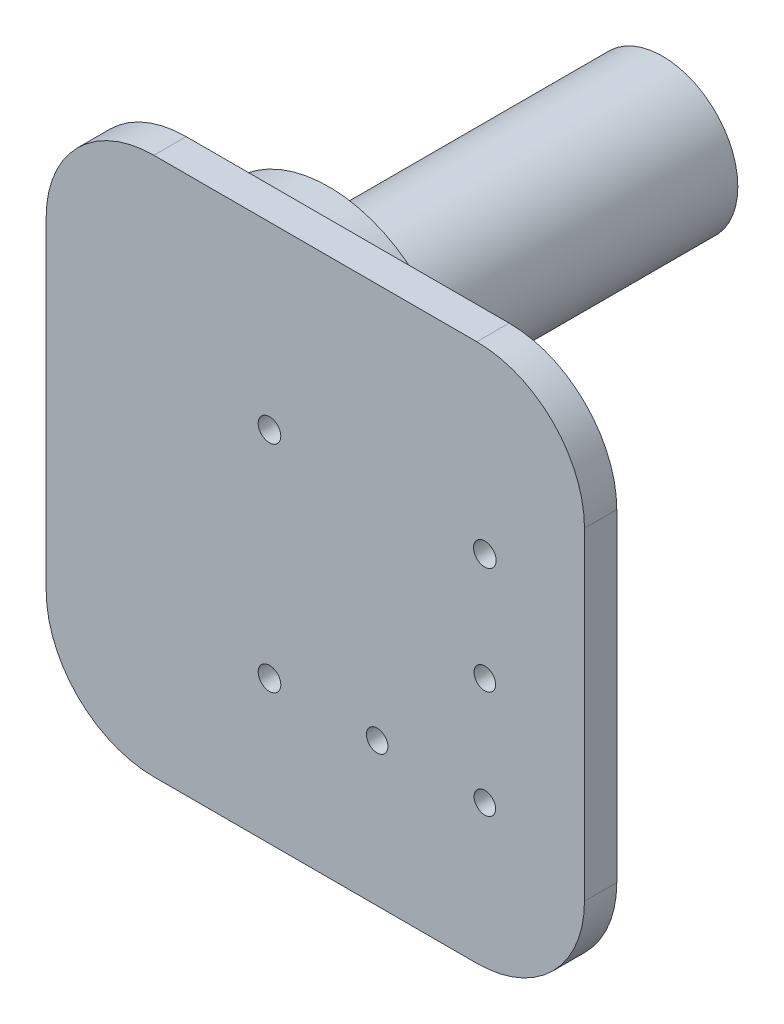
ISO-10303-21;
HEADER;
FILE_DESCRIPTION(('STEP AP214'),'2;1');
FILE_NAME('part.step','',(''),(''),'','','');
FILE_SCHEMA(('AUTOMOTIVE_DESIGN { 1 0 10303 214 1 1 1 1 }'));
ENDSEC;
DATA;
#1=APPLICATION_CONTEXT('core data for automotive mechanical design processes');
#2=APPLICATION_PROTOCOL_DEFINITION('international standard','automotive_design',2000,#1);
#3=PRODUCT_CONTEXT('',#1,'mechanical');
#4=PRODUCT('Part','Part','',(#3));
#5=PRODUCT_RELATED_PRODUCT_CATEGORY('part','',(#4));
#6=PRODUCT_DEFINITION_FORMATION('','',#4);
#7=PRODUCT_DEFINITION_CONTEXT('part definition',#1,'design');
#8=PRODUCT_DEFINITION('design','',#6,#7);
#9=PRODUCT_DEFINITION_SHAPE('','',#8);
#10=(LENGTH_UNIT() NAMED_UNIT(*) SI_UNIT(.MILLI.,.METRE.));
#11=(NAMED_UNIT(*) PLANE_ANGLE_UNIT() SI_UNIT($,.RADIAN.));
#12=(NAMED_UNIT(*) SI_UNIT($,.STERADIAN.) SOLID_ANGLE_UNIT());
#13=UNCERTAINTY_MEASURE_WITH_UNIT(LENGTH_MEASURE(1.E-05),#10,'distance_accuracy_value','');
#14=(GEOMETRIC_REPRESENTATION_CONTEXT(3) GLOBAL_UNCERTAINTY_ASSIGNED_CONTEXT((#13)) GLOBAL_UNIT_ASSIGNED_CONTEXT((#10,
#11,#12)) REPRESENTATION_CONTEXT('',''));
#15=CARTESIAN_POINT('',(0.,0.,0.));
#16=DIRECTION('',(0.,0.,1.));
#17=DIRECTION('',(1.,0.,0.));
#18=AXIS2_PLACEMENT_3D('',#15,#16,#17);
#19=CARTESIAN_POINT('',(-86.6066497970745,-63.7835303855215,34.));
#20=DIRECTION('',(0.,0.,-1.));
#21=DIRECTION('',(-1.,0.,0.));
#22=AXIS2_PLACEMENT_3D('',#19,#20,#21);
#23=CYLINDRICAL_SURFACE('',#22,7.00000000000002);
#24=CARTESIAN_POINT('',(-86.6066497970745,-63.7835303855215,0.));
#25=DIRECTION('',(0.,0.,1.));
#26=DIRECTION('',(1.,0.,0.));
#27=AXIS2_PLACEMENT_3D('',#24,#25,#26);
#28=CIRCLE('',#27,7.00000000000002);
#29=CARTESIAN_POINT('',(-79.6066497970745,-63.7835303855215,0.));
#30=VERTEX_POINT('',#29);
#31=EDGE_CURVE('E154',#30,#30,#28,.T.);
#32=ORIENTED_EDGE('',*,*,#31,.T.);
#33=EDGE_LOOP('',(#32));
#34=FACE_BOUND('',#33,.T.);
#35=CARTESIAN_POINT('',(-86.6066497970745,-63.7835303855215,31.));
#36=DIRECTION('',(0.,0.,1.));
#37=DIRECTION('',(1.,0.,0.));
#38=AXIS2_PLACEMENT_3D('',#35,#36,#37);
#39=CIRCLE('',#38,7.00000000000002);
#40=CARTESIAN_POINT('',(-79.6066497970745,-63.7835303855215,31.));
#41=VERTEX_POINT('',#40);
#42=EDGE_CURVE('E157',#41,#41,#39,.T.);
#43=ORIENTED_EDGE('',*,*,#42,.F.);
#44=EDGE_LOOP('',(#43));
#45=FACE_BOUND('',#44,.T.);
#46=ADVANCED_FACE('F43',(#34,#45),#23,.T.);
#47=CARTESIAN_POINT('',(-86.6066497970745,-63.7835303855215,0.));
#48=DIRECTION('',(0.,0.,1.));
#49=DIRECTION('',(1.,0.,0.));
#50=AXIS2_PLACEMENT_3D('',#47,#48,#49);
#51=PLANE('',#50);
#52=ORIENTED_EDGE('',*,*,#31,.F.);
#53=EDGE_LOOP('',(#52));
#54=FACE_BOUND('',#53,.T.);
#55=ADVANCED_FACE('F254',(#54),#51,.F.);
#56=CARTESIAN_POINT('',(-86.6066497970745,-63.7835303855215,36.));
#57=DIRECTION('',(0.,0.,-1.));
#58=DIRECTION('',(-1.,0.,0.));
#59=AXIS2_PLACEMENT_3D('',#56,#57,#58);
#60=CYLINDRICAL_SURFACE('',#59,12.);
#61=CARTESIAN_POINT('',(-86.6066497970745,-63.7835303855215,36.));
#62=DIRECTION('',(0.,0.,1.));
#63=DIRECTION('',(1.,0.,0.));
#64=AXIS2_PLACEMENT_3D('',#61,#62,#63);
#65=CIRCLE('',#64,12.);
#66=CARTESIAN_POINT('',(-74.6066497970745,-63.7835303855215,36.));
#67=VERTEX_POINT('',#66);
#68=EDGE_CURVE('E150',#67,#67,#65,.T.);
#69=ORIENTED_EDGE('',*,*,#68,.F.);
#70=EDGE_LOOP('',(#69));
#71=FACE_BOUND('',#70,.T.);
#72=CARTESIAN_POINT('',(-86.6066497970745,-63.7835303855215,31.));
#73=DIRECTION('',(0.,0.,1.));
#74=DIRECTION('',(1.,0.,0.));
#75=AXIS2_PLACEMENT_3D('',#72,#73,#74);
#76=CIRCLE('',#75,12.);
#77=CARTESIAN_POINT('',(-74.6066497970745,-63.7835303855215,31.));
#78=VERTEX_POINT('',#77);
#79=EDGE_CURVE('E147',#78,#78,#76,.T.);
#80=ORIENTED_EDGE('',*,*,#79,.T.);
#81=EDGE_LOOP('',(#80));
#82=FACE_BOUND('',#81,.T.);
#83=ADVANCED_FACE('F261',(#71,#82),#60,.T.);
#84=CARTESIAN_POINT('',(-86.6066497970745,-63.7835303855215,31.));
#85=DIRECTION('',(0.,0.,1.));
#86=DIRECTION('',(1.,0.,0.));
#87=AXIS2_PLACEMENT_3D('',#84,#85,#86);
#88=PLANE('',#87);
#89=ORIENTED_EDGE('',*,*,#42,.T.);
#90=EDGE_LOOP('',(#89));
#91=FACE_BOUND('',#90,.T.);
#92=ORIENTED_EDGE('',*,*,#79,.F.);
#93=EDGE_LOOP('',(#92));
#94=FACE_BOUND('',#93,.T.);
#95=ADVANCED_FACE('F392',(#91,#94),#88,.F.);
#96=CARTESIAN_POINT('',(-104.849508922741,-49.3812563089697,39.));
#97=DIRECTION('',(1.,0.,0.));
#98=DIRECTION('',(0.,0.,-1.));
#99=AXIS2_PLACEMENT_3D('',#96,#97,#98);
#100=PLANE('',#99);
#101=DIRECTION('',(0.,-1.,0.));
#102=VECTOR('',#101,1.);
#103=CARTESIAN_POINT('',(-104.849508922741,-49.3812563089697,36.));
#104=LINE('',#103,#102);
#105=CARTESIAN_POINT('',(-104.849508922741,-59.3812563089697,36.));
#106=VERTEX_POINT('',#105);
#107=CARTESIAN_POINT('',(-104.849508922741,-89.3812563089697,36.));
#108=VERTEX_POINT('',#107);
#109=EDGE_CURVE('E136',#106,#108,#104,.T.);
#110=ORIENTED_EDGE('',*,*,#109,.T.);
#111=DIRECTION('',(0.,0.,-1.));
#112=VECTOR('',#111,1.);
#113=CARTESIAN_POINT('',(-104.849508922741,-89.3812563089697,39.));
#114=LINE('',#113,#112);
#115=CARTESIAN_POINT('',(-104.849508922741,-89.3812563089697,39.));
#116=VERTEX_POINT('',#115);
#117=EDGE_CURVE('E114',#108,#116,#114,.F.);
#118=ORIENTED_EDGE('',*,*,#117,.T.);
#119=DIRECTION('',(0.,-1.,0.));
#120=VECTOR('',#119,1.);
#121=CARTESIAN_POINT('',(-104.849508922741,-49.3812563089697,39.));
#122=LINE('',#121,#120);
#123=CARTESIAN_POINT('',(-104.849508922741,-59.3812563089697,39.));
#124=VERTEX_POINT('',#123);
#125=EDGE_CURVE('E146',#124,#116,#122,.T.);
#126=ORIENTED_EDGE('',*,*,#125,.F.);
#127=DIRECTION('',(0.,0.,-1.));
#128=VECTOR('',#127,1.);
#129=CARTESIAN_POINT('',(-104.849508922741,-59.3812563089697,39.));
#130=LINE('',#129,#128);
#131=EDGE_CURVE('E119',#124,#106,#130,.T.);
#132=ORIENTED_EDGE('',*,*,#131,.T.);
#133=EDGE_LOOP('',(#110,#118,#126,#132));
#134=FACE_BOUND('',#133,.T.);
#135=ADVANCED_FACE('F246',(#134),#100,.F.);
#136=CARTESIAN_POINT('',(-104.849508922741,-99.3812563089697,39.));
#137=DIRECTION('',(0.,1.,0.));
#138=DIRECTION('',(0.,0.,1.));
#139=AXIS2_PLACEMENT_3D('',#136,#137,#138);
#140=PLANE('',#139);
#141=DIRECTION('',(1.,0.,0.));
#142=VECTOR('',#141,1.);
#143=CARTESIAN_POINT('',(-104.849508922741,-99.3812563089697,39.));
#144=LINE('',#143,#142);
#145=CARTESIAN_POINT('',(-94.8495089227412,-99.3812563089697,39.));
#146=VERTEX_POINT('',#145);
#147=CARTESIAN_POINT('',(-64.8495089227412,-99.3812563089697,39.));
#148=VERTEX_POINT('',#147);
#149=EDGE_CURVE('E129',#146,#148,#144,.T.);
#150=ORIENTED_EDGE('',*,*,#149,.F.);
#151=DIRECTION('',(0.,0.,-1.));
#152=VECTOR('',#151,1.);
#153=CARTESIAN_POINT('',(-94.8495089227412,-99.3812563089697,39.));
#154=LINE('',#153,#152);
#155=CARTESIAN_POINT('',(-94.8495089227412,-99.3812563089697,36.));
#156=VERTEX_POINT('',#155);
#157=EDGE_CURVE('E113',#146,#156,#154,.T.);
#158=ORIENTED_EDGE('',*,*,#157,.T.);
#159=DIRECTION('',(1.,0.,0.));
#160=VECTOR('',#159,1.);
#161=CARTESIAN_POINT('',(-104.849508922741,-99.3812563089697,36.));
#162=LINE('',#161,#160);
#163=CARTESIAN_POINT('',(-64.8495089227412,-99.3812563089697,36.));
#164=VERTEX_POINT('',#163);
#165=EDGE_CURVE('E126',#156,#164,#162,.T.);
#166=ORIENTED_EDGE('',*,*,#165,.T.);
#167=DIRECTION('',(0.,0.,-1.));
#168=VECTOR('',#167,1.);
#169=CARTESIAN_POINT('',(-64.8495089227412,-99.3812563089697,39.));
#170=LINE('',#169,#168);
#171=EDGE_CURVE('E131',#164,#148,#170,.F.);
#172=ORIENTED_EDGE('',*,*,#171,.T.);
#173=EDGE_LOOP('',(#150,#158,#166,#172));
#174=FACE_BOUND('',#173,.T.);
#175=ADVANCED_FACE('F125',(#174),#140,.F.);
#176=CARTESIAN_POINT('',(-54.8495089227412,-49.3812563089697,39.));
#177=DIRECTION('',(-1.,0.,0.));
#178=DIRECTION('',(0.,-1.,0.));
#179=AXIS2_PLACEMENT_3D('',#176,#177,#178);
#180=PLANE('',#179);
#181=DIRECTION('',(0.,1.,0.));
#182=VECTOR('',#181,1.);
#183=CARTESIAN_POINT('',(-54.8495089227412,-49.3812563089697,39.));
#184=LINE('',#183,#182);
#185=CARTESIAN_POINT('',(-54.8495089227412,-89.3812563089697,39.));
#186=VERTEX_POINT('',#185);
#187=CARTESIAN_POINT('',(-54.8495089227412,-59.3812563089697,39.));
#188=VERTEX_POINT('',#187);
#189=EDGE_CURVE('E199',#186,#188,#184,.T.);
#190=ORIENTED_EDGE('',*,*,#189,.F.);
#191=DIRECTION('',(0.,0.,-1.));
#192=VECTOR('',#191,1.);
#193=CARTESIAN_POINT('',(-54.8495089227412,-89.3812563089697,39.));
#194=LINE('',#193,#192);
#195=CARTESIAN_POINT('',(-54.8495089227412,-89.3812563089697,36.));
#196=VERTEX_POINT('',#195);
#197=EDGE_CURVE('E192',#186,#196,#194,.T.);
#198=ORIENTED_EDGE('',*,*,#197,.T.);
#199=DIRECTION('',(0.,1.,0.));
#200=VECTOR('',#199,1.);
#201=CARTESIAN_POINT('',(-54.8495089227412,-49.3812563089697,36.));
#202=LINE('',#201,#200);
#203=CARTESIAN_POINT('',(-54.8495089227412,-59.3812563089697,36.));
#204=VERTEX_POINT('',#203);
#205=EDGE_CURVE('E135',#196,#204,#202,.T.);
#206=ORIENTED_EDGE('',*,*,#205,.T.);
#207=DIRECTION('',(0.,0.,-1.));
#208=VECTOR('',#207,1.);
#209=CARTESIAN_POINT('',(-54.8495089227412,-59.3812563089697,39.));
#210=LINE('',#209,#208);
#211=EDGE_CURVE('E190',#204,#188,#210,.F.);
#212=ORIENTED_EDGE('',*,*,#211,.T.);
#213=EDGE_LOOP('',(#190,#198,#206,#212));
#214=FACE_BOUND('',#213,.T.);
#215=ADVANCED_FACE('F197',(#214),#180,.F.);
#216=CARTESIAN_POINT('',(-104.849508922741,-49.3812563089697,39.));
#217=DIRECTION('',(0.,-1.,0.));
#218=DIRECTION('',(1.,0.,0.));
#219=AXIS2_PLACEMENT_3D('',#216,#217,#218);
#220=PLANE('',#219);
#221=DIRECTION('',(-1.,0.,0.));
#222=VECTOR('',#221,1.);
#223=CARTESIAN_POINT('',(-104.849508922741,-49.3812563089697,39.));
#224=LINE('',#223,#222);
#225=CARTESIAN_POINT('',(-64.8495089227413,-49.3812563089697,39.));
#226=VERTEX_POINT('',#225);
#227=CARTESIAN_POINT('',(-94.8495089227412,-49.3812563089697,39.));
#228=VERTEX_POINT('',#227);
#229=EDGE_CURVE('E151',#226,#228,#224,.T.);
#230=ORIENTED_EDGE('',*,*,#229,.F.);
#231=DIRECTION('',(0.,0.,-1.));
#232=VECTOR('',#231,1.);
#233=CARTESIAN_POINT('',(-64.8495089227413,-49.3812563089697,39.));
#234=LINE('',#233,#232);
#235=CARTESIAN_POINT('',(-64.8495089227413,-49.3812563089697,36.));
#236=VERTEX_POINT('',#235);
#237=EDGE_CURVE('E11',#226,#236,#234,.T.);
#238=ORIENTED_EDGE('',*,*,#237,.T.);
#239=DIRECTION('',(-1.,0.,0.));
#240=VECTOR('',#239,1.);
#241=CARTESIAN_POINT('',(-104.849508922741,-49.3812563089697,36.));
#242=LINE('',#241,#240);
#243=CARTESIAN_POINT('',(-94.8495089227412,-49.3812563089697,36.));
#244=VERTEX_POINT('',#243);
#245=EDGE_CURVE('E139',#236,#244,#242,.T.);
#246=ORIENTED_EDGE('',*,*,#245,.T.);
#247=DIRECTION('',(0.,0.,-1.));
#248=VECTOR('',#247,1.);
#249=CARTESIAN_POINT('',(-94.8495089227412,-49.3812563089697,39.));
#250=LINE('',#249,#248);
#251=EDGE_CURVE('E51',#244,#228,#250,.F.);
#252=ORIENTED_EDGE('',*,*,#251,.T.);
#253=EDGE_LOOP('',(#230,#238,#246,#252));
#254=FACE_BOUND('',#253,.T.);
#255=ADVANCED_FACE('F206',(#254),#220,.F.);
#256=CARTESIAN_POINT('',(0.,0.,39.));
#257=DIRECTION('',(0.,0.,1.));
#258=DIRECTION('',(1.,0.,0.));
#259=AXIS2_PLACEMENT_3D('',#256,#257,#258);
#260=PLANE('',#259);
#261=CARTESIAN_POINT('',(-84.1066497970746,-66.0878554482292,39.));
#262=DIRECTION('',(0.,0.,1.));
#263=DIRECTION('',(1.,0.,0.));
#264=AXIS2_PLACEMENT_3D('',#261,#262,#263);
#265=CIRCLE('',#264,1.04999999999999);
#266=CARTESIAN_POINT('',(-83.0566497970746,-66.0878554482292,39.));
#267=VERTEX_POINT('',#266);
#268=EDGE_CURVE('E215',#267,#267,#265,.T.);
#269=ORIENTED_EDGE('',*,*,#268,.F.);
#270=EDGE_LOOP('',(#269));
#271=FACE_BOUND('',#270,.T.);
#272=CARTESIAN_POINT('',(-74.1066497970747,-86.0878554482293,39.));
#273=DIRECTION('',(0.,0.,1.));
#274=DIRECTION('',(1.,0.,0.));
#275=AXIS2_PLACEMENT_3D('',#272,#273,#274);
#276=CIRCLE('',#275,0.999999999999375);
#277=CARTESIAN_POINT('',(-73.1066497970754,-86.0878554482293,39.));
#278=VERTEX_POINT('',#277);
#279=EDGE_CURVE('E223',#278,#278,#276,.T.);
#280=ORIENTED_EDGE('',*,*,#279,.F.);
#281=EDGE_LOOP('',(#280));
#282=FACE_BOUND('',#281,.T.);
#283=CARTESIAN_POINT('',(-64.1066497970747,-86.0878554482293,39.));
#284=DIRECTION('',(0.,0.,1.));
#285=DIRECTION('',(1.,0.,0.));
#286=AXIS2_PLACEMENT_3D('',#283,#284,#285);
#287=CIRCLE('',#286,0.999999999999998);
#288=CARTESIAN_POINT('',(-63.1066497970747,-86.0878554482293,39.));
#289=VERTEX_POINT('',#288);
#290=EDGE_CURVE('E219',#289,#289,#287,.T.);
#291=ORIENTED_EDGE('',*,*,#290,.F.);
#292=EDGE_LOOP('',(#291));
#293=FACE_BOUND('',#292,.T.);
#294=CARTESIAN_POINT('',(-64.106649797075,-76.0878554482282,39.));
#295=DIRECTION('',(0.,0.,1.));
#296=DIRECTION('',(1.,0.,0.));
#297=AXIS2_PLACEMENT_3D('',#294,#295,#296);
#298=CIRCLE('',#297,0.999999999999998);
#299=CARTESIAN_POINT('',(-63.106649797075,-76.0878554482282,39.));
#300=VERTEX_POINT('',#299);
#301=EDGE_CURVE('E216',#300,#300,#298,.T.);
#302=ORIENTED_EDGE('',*,*,#301,.F.);
#303=EDGE_LOOP('',(#302));
#304=FACE_BOUND('',#303,.T.);
#305=CARTESIAN_POINT('',(-64.106649797075,-66.0878554482282,39.));
#306=DIRECTION('',(0.,0.,1.));
#307=DIRECTION('',(1.,0.,0.));
#308=AXIS2_PLACEMENT_3D('',#305,#306,#307);
#309=CIRCLE('',#308,1.04999999999999);
#310=CARTESIAN_POINT('',(-63.056649797075,-66.0878554482282,39.));
#311=VERTEX_POINT('',#310);
#312=EDGE_CURVE('E220',#311,#311,#309,.T.);
#313=ORIENTED_EDGE('',*,*,#312,.F.);
#314=EDGE_LOOP('',(#313));
#315=FACE_BOUND('',#314,.T.);
#316=CARTESIAN_POINT('',(-84.1066497970747,-86.0878554482292,39.));
#317=DIRECTION('',(0.,0.,1.));
#318=DIRECTION('',(1.,0.,0.));
#319=AXIS2_PLACEMENT_3D('',#316,#317,#318);
#320=CIRCLE('',#319,1.05000000000001);
#321=CARTESIAN_POINT('',(-83.0566497970747,-86.0878554482292,39.));
#322=VERTEX_POINT('',#321);
#323=EDGE_CURVE('E164',#322,#322,#320,.T.);
#324=ORIENTED_EDGE('',*,*,#323,.F.);
#325=EDGE_LOOP('',(#324));
#326=FACE_BOUND('',#325,.T.);
#327=ORIENTED_EDGE('',*,*,#125,.T.);
#328=CARTESIAN_POINT('',(-94.8495089227412,-89.3812563089697,39.));
#329=DIRECTION('',(0.,0.,1.));
#330=DIRECTION('',(1.,0.,0.));
#331=AXIS2_PLACEMENT_3D('',#328,#329,#330);
#332=CIRCLE('',#331,10.);
#333=EDGE_CURVE('E188',#116,#146,#332,.T.);
#334=ORIENTED_EDGE('',*,*,#333,.T.);
#335=ORIENTED_EDGE('',*,*,#149,.T.);
#336=CARTESIAN_POINT('',(-64.8495089227412,-89.3812563089697,39.));
#337=DIRECTION('',(0.,0.,1.));
#338=DIRECTION('',(1.,0.,0.));
#339=AXIS2_PLACEMENT_3D('',#336,#337,#338);
#340=CIRCLE('',#339,10.);
#341=EDGE_CURVE('E186',#148,#186,#340,.T.);
#342=ORIENTED_EDGE('',*,*,#341,.T.);
#343=ORIENTED_EDGE('',*,*,#189,.T.);
#344=CARTESIAN_POINT('',(-64.8495089227413,-59.3812563089697,39.));
#345=DIRECTION('',(0.,0.,1.));
#346=DIRECTION('',(1.,0.,0.));
#347=AXIS2_PLACEMENT_3D('',#344,#345,#346);
#348=CIRCLE('',#347,10.);
#349=EDGE_CURVE('E64',#188,#226,#348,.T.);
#350=ORIENTED_EDGE('',*,*,#349,.T.);
#351=ORIENTED_EDGE('',*,*,#229,.T.);
#352=CARTESIAN_POINT('',(-94.8495089227412,-59.3812563089697,39.));
#353=DIRECTION('',(0.,0.,1.));
#354=DIRECTION('',(1.,0.,0.));
#355=AXIS2_PLACEMENT_3D('',#352,#353,#354);
#356=CIRCLE('',#355,10.);
#357=EDGE_CURVE('E183',#228,#124,#356,.T.);
#358=ORIENTED_EDGE('',*,*,#357,.T.);
#359=EDGE_LOOP('',(#327,#334,#335,#342,#343,#350,#351,#358));
#360=FACE_BOUND('',#359,.T.);
#361=ADVANCED_FACE('F237',(#271,#282,#293,#304,#315,#326,#360),#260,.T.);
#362=CARTESIAN_POINT('',(0.,0.,36.));
#363=DIRECTION('',(0.,0.,1.));
#364=DIRECTION('',(1.,0.,0.));
#365=AXIS2_PLACEMENT_3D('',#362,#363,#364);
#366=PLANE('',#365);
#367=CARTESIAN_POINT('',(-74.1066497970747,-86.0878554482293,36.));
#368=DIRECTION('',(0.,0.,1.));
#369=DIRECTION('',(1.,0.,0.));
#370=AXIS2_PLACEMENT_3D('',#367,#368,#369);
#371=CIRCLE('',#370,0.999999999999375);
#372=CARTESIAN_POINT('',(-73.1066497970754,-86.0878554482293,36.));
#373=VERTEX_POINT('',#372);
#374=EDGE_CURVE('E141',#373,#373,#371,.T.);
#375=ORIENTED_EDGE('',*,*,#374,.T.);
#376=EDGE_LOOP('',(#375));
#377=FACE_BOUND('',#376,.T.);
#378=CARTESIAN_POINT('',(-64.1066497970747,-86.0878554482293,36.));
#379=DIRECTION('',(0.,0.,1.));
#380=DIRECTION('',(1.,0.,0.));
#381=AXIS2_PLACEMENT_3D('',#378,#379,#380);
#382=CIRCLE('',#381,0.999999999999998);
#383=CARTESIAN_POINT('',(-63.1066497970747,-86.0878554482293,36.));
#384=VERTEX_POINT('',#383);
#385=EDGE_CURVE('E170',#384,#384,#382,.T.);
#386=ORIENTED_EDGE('',*,*,#385,.T.);
#387=EDGE_LOOP('',(#386));
#388=FACE_BOUND('',#387,.T.);
#389=CARTESIAN_POINT('',(-64.106649797075,-76.0878554482282,36.));
#390=DIRECTION('',(0.,0.,1.));
#391=DIRECTION('',(1.,0.,0.));
#392=AXIS2_PLACEMENT_3D('',#389,#390,#391);
#393=CIRCLE('',#392,0.999999999999998);
#394=CARTESIAN_POINT('',(-63.106649797075,-76.0878554482282,36.));
#395=VERTEX_POINT('',#394);
#396=EDGE_CURVE('E167',#395,#395,#393,.T.);
#397=ORIENTED_EDGE('',*,*,#396,.T.);
#398=EDGE_LOOP('',(#397));
#399=FACE_BOUND('',#398,.T.);
#400=CARTESIAN_POINT('',(-64.106649797075,-66.0878554482282,36.));
#401=DIRECTION('',(0.,0.,1.));
#402=DIRECTION('',(1.,0.,0.));
#403=AXIS2_PLACEMENT_3D('',#400,#401,#402);
#404=CIRCLE('',#403,1.04999999999999);
#405=CARTESIAN_POINT('',(-63.056649797075,-66.0878554482282,36.));
#406=VERTEX_POINT('',#405);
#407=EDGE_CURVE('E163',#406,#406,#404,.T.);
#408=ORIENTED_EDGE('',*,*,#407,.T.);
#409=EDGE_LOOP('',(#408));
#410=FACE_BOUND('',#409,.T.);
#411=CARTESIAN_POINT('',(-84.1066497970747,-86.0878554482292,36.));
#412=DIRECTION('',(0.,0.,1.));
#413=DIRECTION('',(1.,0.,0.));
#414=AXIS2_PLACEMENT_3D('',#411,#412,#413);
#415=CIRCLE('',#414,1.05000000000001);
#416=CARTESIAN_POINT('',(-83.0566497970747,-86.0878554482292,36.));
#417=VERTEX_POINT('',#416);
#418=EDGE_CURVE('E160',#417,#417,#415,.T.);
#419=ORIENTED_EDGE('',*,*,#418,.T.);
#420=EDGE_LOOP('',(#419));
#421=FACE_BOUND('',#420,.T.);
#422=ORIENTED_EDGE('',*,*,#68,.T.);
#423=EDGE_LOOP('',(#422));
#424=FACE_BOUND('',#423,.T.);
#425=ORIENTED_EDGE('',*,*,#165,.F.);
#426=CARTESIAN_POINT('',(-94.8495089227412,-89.3812563089697,36.));
#427=DIRECTION('',(0.,0.,1.));
#428=DIRECTION('',(1.,0.,0.));
#429=AXIS2_PLACEMENT_3D('',#426,#427,#428);
#430=CIRCLE('',#429,10.);
#431=EDGE_CURVE('E109',#156,#108,#430,.F.);
#432=ORIENTED_EDGE('',*,*,#431,.T.);
#433=ORIENTED_EDGE('',*,*,#109,.F.);
#434=CARTESIAN_POINT('',(-94.8495089227412,-59.3812563089697,36.));
#435=DIRECTION('',(0.,0.,1.));
#436=DIRECTION('',(1.,0.,0.));
#437=AXIS2_PLACEMENT_3D('',#434,#435,#436);
#438=CIRCLE('',#437,10.);
#439=EDGE_CURVE('E130',#106,#244,#438,.F.);
#440=ORIENTED_EDGE('',*,*,#439,.T.);
#441=ORIENTED_EDGE('',*,*,#245,.F.);
#442=CARTESIAN_POINT('',(-64.8495089227413,-59.3812563089697,36.));
#443=DIRECTION('',(0.,0.,1.));
#444=DIRECTION('',(1.,0.,0.));
#445=AXIS2_PLACEMENT_3D('',#442,#443,#444);
#446=CIRCLE('',#445,10.);
#447=EDGE_CURVE('E177',#236,#204,#446,.F.);
#448=ORIENTED_EDGE('',*,*,#447,.T.);
#449=ORIENTED_EDGE('',*,*,#205,.F.);
#450=CARTESIAN_POINT('',(-64.8495089227412,-89.3812563089697,36.));
#451=DIRECTION('',(0.,0.,1.));
#452=DIRECTION('',(1.,0.,0.));
#453=AXIS2_PLACEMENT_3D('',#450,#451,#452);
#454=CIRCLE('',#453,10.);
#455=EDGE_CURVE('E120',#196,#164,#454,.F.);
#456=ORIENTED_EDGE('',*,*,#455,.T.);
#457=EDGE_LOOP('',(#425,#432,#433,#440,#441,#448,#449,#456));
#458=FACE_BOUND('',#457,.T.);
#459=ADVANCED_FACE('F133',(#377,#388,#399,#410,#421,#424,#458),#366,.F.);
#460=CARTESIAN_POINT('',(-84.1066497970747,-86.0878554482292,34.));
#461=DIRECTION('',(0.,0.,1.));
#462=DIRECTION('',(1.,0.,0.));
#463=AXIS2_PLACEMENT_3D('',#460,#461,#462);
#464=CYLINDRICAL_SURFACE('',#463,1.05000000000001);
#465=ORIENTED_EDGE('',*,*,#323,.T.);
#466=EDGE_LOOP('',(#465));
#467=FACE_BOUND('',#466,.T.);
#468=ORIENTED_EDGE('',*,*,#418,.F.);
#469=EDGE_LOOP('',(#468));
#470=FACE_BOUND('',#469,.T.);
#471=ADVANCED_FACE('F343',(#467,#470),#464,.F.);
#472=CARTESIAN_POINT('',(-64.106649797075,-66.0878554482282,34.));
#473=DIRECTION('',(0.,0.,1.));
#474=DIRECTION('',(1.,0.,0.));
#475=AXIS2_PLACEMENT_3D('',#472,#473,#474);
#476=CYLINDRICAL_SURFACE('',#475,1.04999999999999);
#477=ORIENTED_EDGE('',*,*,#312,.T.);
#478=EDGE_LOOP('',(#477));
#479=FACE_BOUND('',#478,.T.);
#480=ORIENTED_EDGE('',*,*,#407,.F.);
#481=EDGE_LOOP('',(#480));
#482=FACE_BOUND('',#481,.T.);
#483=ADVANCED_FACE('F234',(#479,#482),#476,.F.);
#484=CARTESIAN_POINT('',(-64.106649797075,-76.0878554482282,34.));
#485=DIRECTION('',(0.,0.,1.));
#486=DIRECTION('',(1.,0.,0.));
#487=AXIS2_PLACEMENT_3D('',#484,#485,#486);
#488=CYLINDRICAL_SURFACE('',#487,0.999999999999998);
#489=ORIENTED_EDGE('',*,*,#301,.T.);
#490=EDGE_LOOP('',(#489));
#491=FACE_BOUND('',#490,.T.);
#492=ORIENTED_EDGE('',*,*,#396,.F.);
#493=EDGE_LOOP('',(#492));
#494=FACE_BOUND('',#493,.T.);
#495=ADVANCED_FACE('F326',(#491,#494),#488,.F.);
#496=CARTESIAN_POINT('',(-64.1066497970747,-86.0878554482293,34.));
#497=DIRECTION('',(0.,0.,1.));
#498=DIRECTION('',(1.,0.,0.));
#499=AXIS2_PLACEMENT_3D('',#496,#497,#498);
#500=CYLINDRICAL_SURFACE('',#499,0.999999999999998);
#501=ORIENTED_EDGE('',*,*,#290,.T.);
#502=EDGE_LOOP('',(#501));
#503=FACE_BOUND('',#502,.T.);
#504=ORIENTED_EDGE('',*,*,#385,.F.);
#505=EDGE_LOOP('',(#504));
#506=FACE_BOUND('',#505,.T.);
#507=ADVANCED_FACE('F317',(#503,#506),#500,.F.);
#508=CARTESIAN_POINT('',(-74.1066497970747,-86.0878554482293,34.));
#509=DIRECTION('',(0.,0.,1.));
#510=DIRECTION('',(1.,0.,0.));
#511=AXIS2_PLACEMENT_3D('',#508,#509,#510);
#512=CYLINDRICAL_SURFACE('',#511,0.999999999999375);
#513=ORIENTED_EDGE('',*,*,#279,.T.);
#514=EDGE_LOOP('',(#513));
#515=FACE_BOUND('',#514,.T.);
#516=ORIENTED_EDGE('',*,*,#374,.F.);
#517=EDGE_LOOP('',(#516));
#518=FACE_BOUND('',#517,.T.);
#519=ADVANCED_FACE('F308',(#515,#518),#512,.F.);
#520=CARTESIAN_POINT('',(-84.1066497970746,-66.0878554482292,34.));
#521=DIRECTION('',(0.,0.,1.));
#522=DIRECTION('',(1.,0.,0.));
#523=AXIS2_PLACEMENT_3D('',#520,#521,#522);
#524=CYLINDRICAL_SURFACE('',#523,1.04999999999999);
#525=CARTESIAN_POINT('',(-84.1066497970746,-66.0878554482292,34.));
#526=DIRECTION('',(0.,0.,1.));
#527=DIRECTION('',(1.,0.,0.));
#528=AXIS2_PLACEMENT_3D('',#525,#526,#527);
#529=CIRCLE('',#528,1.04999999999999);
#530=CARTESIAN_POINT('',(-83.0566497970746,-66.0878554482292,34.));
#531=VERTEX_POINT('',#530);
#532=EDGE_CURVE('E226',#531,#531,#529,.T.);
#533=ORIENTED_EDGE('',*,*,#532,.F.);
#534=EDGE_LOOP('',(#533));
#535=FACE_BOUND('',#534,.T.);
#536=ORIENTED_EDGE('',*,*,#268,.T.);
#537=EDGE_LOOP('',(#536));
#538=FACE_BOUND('',#537,.T.);
#539=ADVANCED_FACE('F299',(#535,#538),#524,.F.);
#540=CARTESIAN_POINT('',(-84.1066497970746,-66.0878554482292,34.));
#541=DIRECTION('',(0.,0.,1.));
#542=DIRECTION('',(1.,0.,0.));
#543=AXIS2_PLACEMENT_3D('',#540,#541,#542);
#544=PLANE('',#543);
#545=ORIENTED_EDGE('',*,*,#532,.T.);
#546=EDGE_LOOP('',(#545));
#547=FACE_BOUND('',#546,.T.);
#548=ADVANCED_FACE('F269',(#547),#544,.T.);
#549=CARTESIAN_POINT('',(-94.8495089227412,-89.3812563089697,39.));
#550=DIRECTION('',(0.,0.,-1.));
#551=DIRECTION('',(-1.,0.,0.));
#552=AXIS2_PLACEMENT_3D('',#549,#550,#551);
#553=CYLINDRICAL_SURFACE('',#552,10.);
#554=ORIENTED_EDGE('',*,*,#333,.F.);
#555=ORIENTED_EDGE('',*,*,#117,.F.);
#556=ORIENTED_EDGE('',*,*,#431,.F.);
#557=ORIENTED_EDGE('',*,*,#157,.F.);
#558=EDGE_LOOP('',(#554,#555,#556,#557));
#559=FACE_BOUND('',#558,.T.);
#560=ADVANCED_FACE('F112',(#559),#553,.T.);
#561=CARTESIAN_POINT('',(-64.8495089227412,-89.3812563089697,39.));
#562=DIRECTION('',(0.,0.,-1.));
#563=DIRECTION('',(-1.,0.,0.));
#564=AXIS2_PLACEMENT_3D('',#561,#562,#563);
#565=CYLINDRICAL_SURFACE('',#564,10.);
#566=ORIENTED_EDGE('',*,*,#341,.F.);
#567=ORIENTED_EDGE('',*,*,#171,.F.);
#568=ORIENTED_EDGE('',*,*,#455,.F.);
#569=ORIENTED_EDGE('',*,*,#197,.F.);
#570=EDGE_LOOP('',(#566,#567,#568,#569));
#571=FACE_BOUND('',#570,.T.);
#572=ADVANCED_FACE('F252',(#571),#565,.T.);
#573=CARTESIAN_POINT('',(-64.8495089227413,-59.3812563089697,39.));
#574=DIRECTION('',(0.,0.,-1.));
#575=DIRECTION('',(-1.,0.,0.));
#576=AXIS2_PLACEMENT_3D('',#573,#574,#575);
#577=CYLINDRICAL_SURFACE('',#576,10.);
#578=ORIENTED_EDGE('',*,*,#349,.F.);
#579=ORIENTED_EDGE('',*,*,#211,.F.);
#580=ORIENTED_EDGE('',*,*,#447,.F.);
#581=ORIENTED_EDGE('',*,*,#237,.F.);
#582=EDGE_LOOP('',(#578,#579,#580,#581));
#583=FACE_BOUND('',#582,.T.);
#584=ADVANCED_FACE('F205',(#583),#577,.T.);
#585=CARTESIAN_POINT('',(-94.8495089227412,-59.3812563089697,39.));
#586=DIRECTION('',(0.,0.,-1.));
#587=DIRECTION('',(-1.,0.,0.));
#588=AXIS2_PLACEMENT_3D('',#585,#586,#587);
#589=CYLINDRICAL_SURFACE('',#588,10.);
#590=ORIENTED_EDGE('',*,*,#357,.F.);
#591=ORIENTED_EDGE('',*,*,#251,.F.);
#592=ORIENTED_EDGE('',*,*,#439,.F.);
#593=ORIENTED_EDGE('',*,*,#131,.F.);
#594=EDGE_LOOP('',(#590,#591,#592,#593));
#595=FACE_BOUND('',#594,.T.);
#596=ADVANCED_FACE('F45',(#595),#589,.T.);
#597=CLOSED_SHELL('',(#46,#55,#83,#95,#135,#175,#215,#255,#361,#459,#471,#483,#495,#507,#519,
#539,#548,#560,#572,#584,#596));
#598=MANIFOLD_SOLID_BREP('B2',#597);
#599=ADVANCED_BREP_SHAPE_REPRESENTATION('',(#18,#598),#14);
#600=SHAPE_DEFINITION_REPRESENTATION(#9,#599);
ENDSEC;
END-ISO-10303-21;
